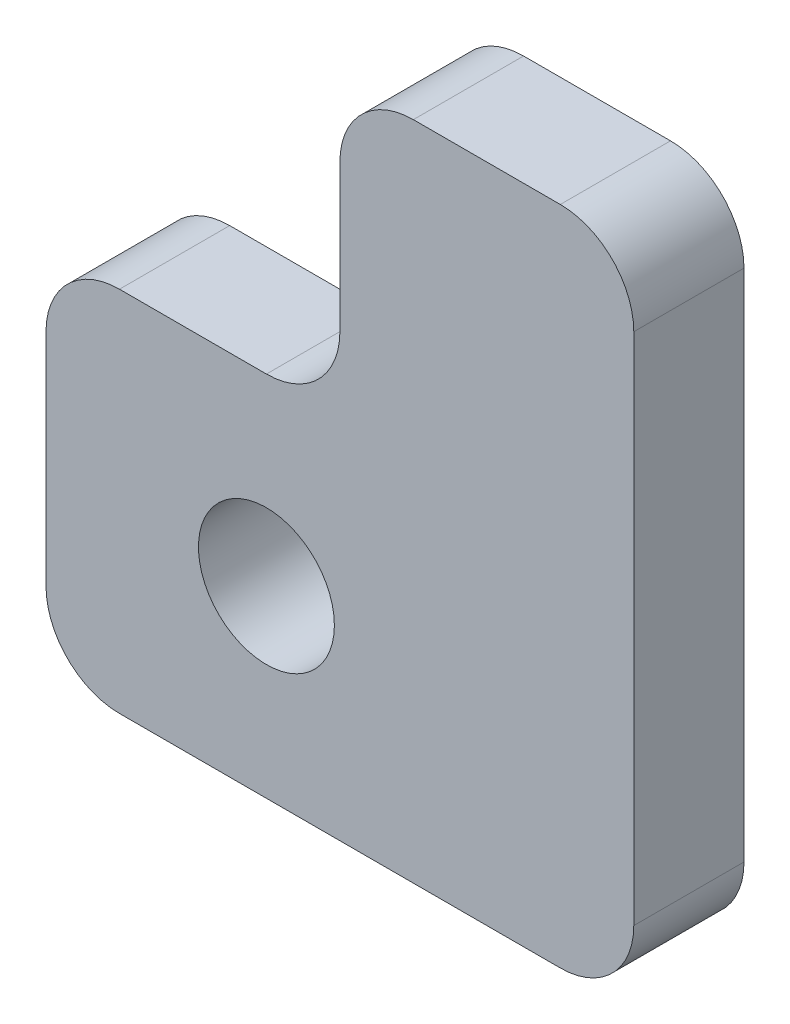
ISO-10303-21;
HEADER;
FILE_DESCRIPTION(('STEP AP214'),'2;1');
FILE_NAME('part.step','',(''),(''),'','','');
FILE_SCHEMA(('AUTOMOTIVE_DESIGN { 1 0 10303 214 1 1 1 1 }'));
ENDSEC;
DATA;
#1=APPLICATION_CONTEXT('core data for automotive mechanical design processes');
#2=APPLICATION_PROTOCOL_DEFINITION('international standard','automotive_design',2000,#1);
#3=PRODUCT_CONTEXT('',#1,'mechanical');
#4=PRODUCT('Part','Part','',(#3));
#5=PRODUCT_RELATED_PRODUCT_CATEGORY('part','',(#4));
#6=PRODUCT_DEFINITION_FORMATION('','',#4);
#7=PRODUCT_DEFINITION_CONTEXT('part definition',#1,'design');
#8=PRODUCT_DEFINITION('design','',#6,#7);
#9=PRODUCT_DEFINITION_SHAPE('','',#8);
#10=(LENGTH_UNIT() NAMED_UNIT(*) SI_UNIT(.MILLI.,.METRE.));
#11=(NAMED_UNIT(*) PLANE_ANGLE_UNIT() SI_UNIT($,.RADIAN.));
#12=(NAMED_UNIT(*) SI_UNIT($,.STERADIAN.) SOLID_ANGLE_UNIT());
#13=UNCERTAINTY_MEASURE_WITH_UNIT(LENGTH_MEASURE(1.E-05),#10,'distance_accuracy_value','');
#14=(GEOMETRIC_REPRESENTATION_CONTEXT(3) GLOBAL_UNCERTAINTY_ASSIGNED_CONTEXT((#13)) GLOBAL_UNIT_ASSIGNED_CONTEXT((#10,
#11,#12)) REPRESENTATION_CONTEXT('',''));
#15=CARTESIAN_POINT('',(0.,0.,0.));
#16=DIRECTION('',(0.,0.,1.));
#17=DIRECTION('',(1.,0.,0.));
#18=AXIS2_PLACEMENT_3D('',#15,#16,#17);
#19=CARTESIAN_POINT('',(-166.520340409626,18.1367473035253,-2.99999999999833));
#20=DIRECTION('',(0.,-1.,0.));
#21=DIRECTION('',(1.,0.,0.));
#22=AXIS2_PLACEMENT_3D('',#19,#20,#21);
#23=PLANE('',#22);
#24=DIRECTION('',(-1.,0.,0.));
#25=VECTOR('',#24,1.);
#26=CARTESIAN_POINT('',(-166.520340409626,18.1367473035253,1.67378461437092E-12));
#27=LINE('',#26,#25);
#28=CARTESIAN_POINT('',(-172.520340409626,18.1367473035253,1.67363592378726E-12));
#29=VERTEX_POINT('',#28);
#30=CARTESIAN_POINT('',(-176.520340409626,18.1367473035253,1.67353679673149E-12));
#31=VERTEX_POINT('',#30);
#32=EDGE_CURVE('E223',#29,#31,#27,.T.);
#33=ORIENTED_EDGE('',*,*,#32,.F.);
#34=DIRECTION('',(0.,0.,1.));
#35=VECTOR('',#34,1.);
#36=CARTESIAN_POINT('',(-172.520340409626,18.1367473035253,-2.99999999999832));
#37=LINE('',#36,#35);
#38=CARTESIAN_POINT('',(-172.520340409626,18.1367473035253,-2.99999999999833));
#39=VERTEX_POINT('',#38);
#40=EDGE_CURVE('E234',#29,#39,#37,.F.);
#41=ORIENTED_EDGE('',*,*,#40,.T.);
#42=DIRECTION('',(-1.,0.,0.));
#43=VECTOR('',#42,1.);
#44=CARTESIAN_POINT('',(-166.520340409626,18.1367473035253,-2.99999999999833));
#45=LINE('',#44,#43);
#46=CARTESIAN_POINT('',(-176.520340409626,18.1367473035253,-2.99999999999833));
#47=VERTEX_POINT('',#46);
#48=EDGE_CURVE('E220',#39,#47,#45,.T.);
#49=ORIENTED_EDGE('',*,*,#48,.T.);
#50=DIRECTION('',(0.,0.,1.));
#51=VECTOR('',#50,1.);
#52=CARTESIAN_POINT('',(-176.520340409626,18.1367473035253,1.67357447344862E-12));
#53=LINE('',#52,#51);
#54=EDGE_CURVE('E231',#47,#31,#53,.T.);
#55=ORIENTED_EDGE('',*,*,#54,.T.);
#56=EDGE_LOOP('',(#33,#41,#49,#55));
#57=FACE_BOUND('',#56,.T.);
#58=ADVANCED_FACE('F44',(#57),#23,.F.);
#59=CARTESIAN_POINT('',(-166.520340409626,0.,0.));
#60=DIRECTION('',(-1.,0.,0.));
#61=DIRECTION('',(0.,0.,1.));
#62=AXIS2_PLACEMENT_3D('',#59,#60,#61);
#63=PLANE('',#62);
#64=DIRECTION('',(0.,1.,0.));
#65=VECTOR('',#64,1.);
#66=CARTESIAN_POINT('',(-166.520340409626,0.,-2.99999999999833));
#67=LINE('',#66,#65);
#68=CARTESIAN_POINT('',(-166.520340409626,11.3353998415927,-2.99999999999833));
#69=VERTEX_POINT('',#68);
#70=CARTESIAN_POINT('',(-166.520340409626,14.9357670611535,-2.99999999999833));
#71=VERTEX_POINT('',#70);
#72=EDGE_CURVE('E171',#69,#71,#67,.T.);
#73=ORIENTED_EDGE('',*,*,#72,.F.);
#74=DIRECTION('',(0.,-0.624695047554423,0.780868809443031));
#75=VECTOR('',#74,1.);
#76=CARTESIAN_POINT('',(-166.520340409626,13.1355834513731,-5.25022951222383));
#77=LINE('',#76,#75);
#78=CARTESIAN_POINT('',(-166.520340409626,13.1355834513731,-5.25022951222383));
#79=VERTEX_POINT('',#78);
#80=EDGE_CURVE('E175',#79,#69,#77,.T.);
#81=ORIENTED_EDGE('',*,*,#80,.F.);
#82=DIRECTION('',(0.,-0.624695047554423,-0.780868809443031));
#83=VECTOR('',#82,1.);
#84=CARTESIAN_POINT('',(-166.520340409626,14.9357670611535,-2.99999999999833));
#85=LINE('',#84,#83);
#86=EDGE_CURVE('E177',#71,#79,#85,.T.);
#87=ORIENTED_EDGE('',*,*,#86,.F.);
#88=EDGE_LOOP('',(#73,#81,#87));
#89=FACE_BOUND('',#88,.T.);
#90=ADVANCED_FACE('F173',(#89),#63,.F.);
#91=CARTESIAN_POINT('',(-166.520340409626,13.1355834513731,-5.25022951222383));
#92=DIRECTION('',(0.,-0.780868809443031,-0.624695047554423));
#93=DIRECTION('',(0.,0.624695047554423,-0.780868809443031));
#94=AXIS2_PLACEMENT_3D('',#91,#92,#93);
#95=PLANE('',#94);
#96=CARTESIAN_POINT('',(-172.520340409626,13.1367473035253,-5.25168432741411));
#97=DIRECTION('',(0.,-0.780868809443031,-0.624695047554423));
#98=DIRECTION('',(0.,-0.624695047554423,0.780868809443031));
#99=AXIS2_PLACEMENT_3D('',#96,#97,#98);
#100=ELLIPSE('',#99,2.9614449598127,1.85);
#101=CARTESIAN_POINT('',(-172.941822700344,11.3353998415927,-2.99999999999833));
#102=VERTEX_POINT('',#101);
#103=CARTESIAN_POINT('',(-174.370340043531,13.1355834513731,-5.25022951222383));
#104=VERTEX_POINT('',#103);
#105=EDGE_CURVE('E318',#102,#104,#100,.T.);
#106=ORIENTED_EDGE('',*,*,#105,.F.);
#107=DIRECTION('',(-1.,0.,0.));
#108=VECTOR('',#107,1.);
#109=CARTESIAN_POINT('',(-166.520340409626,11.3353998415927,-2.99999999999833));
#110=LINE('',#109,#108);
#111=CARTESIAN_POINT('',(-178.520340409626,11.3353998415927,-2.99999999999833));
#112=VERTEX_POINT('',#111);
#113=EDGE_CURVE('E190',#102,#112,#110,.T.);
#114=ORIENTED_EDGE('',*,*,#113,.T.);
#115=DIRECTION('',(0.,-0.624695047554423,0.780868809443031));
#116=VECTOR('',#115,1.);
#117=CARTESIAN_POINT('',(-178.520340409626,13.1355834513731,-5.25022951222383));
#118=LINE('',#117,#116);
#119=CARTESIAN_POINT('',(-178.520340409626,13.1355834513731,-5.25022951222383));
#120=VERTEX_POINT('',#119);
#121=EDGE_CURVE('E199',#120,#112,#118,.T.);
#122=ORIENTED_EDGE('',*,*,#121,.F.);
#123=DIRECTION('',(-1.,0.,0.));
#124=VECTOR('',#123,1.);
#125=CARTESIAN_POINT('',(-166.520340409626,13.1355834513731,-5.25022951222383));
#126=LINE('',#125,#124);
#127=EDGE_CURVE('E216',#104,#120,#126,.T.);
#128=ORIENTED_EDGE('',*,*,#127,.F.);
#129=EDGE_LOOP('',(#106,#114,#122,#128));
#130=FACE_BOUND('',#129,.T.);
#131=ADVANCED_FACE('F333',(#130),#95,.T.);
#132=CARTESIAN_POINT('',(-166.520340409626,14.9357670611535,-2.99999999999833));
#133=DIRECTION('',(0.,0.780868809443031,-0.624695047554423));
#134=DIRECTION('',(0.,0.624695047554423,0.780868809443031));
#135=AXIS2_PLACEMENT_3D('',#132,#133,#134);
#136=PLANE('',#135);
#137=CARTESIAN_POINT('',(-172.520340409626,13.1367473035253,-5.24877469703356));
#138=DIRECTION('',(0.,0.780868809443031,-0.624695047554423));
#139=DIRECTION('',(0.,0.624695047554423,0.780868809443031));
#140=AXIS2_PLACEMENT_3D('',#137,#138,#139);
#141=ELLIPSE('',#140,2.9614449598127,1.85);
#142=CARTESIAN_POINT('',(-172.089030878473,14.9357670611535,-2.99999999999833));
#143=VERTEX_POINT('',#142);
#144=CARTESIAN_POINT('',(-170.670340775721,13.1355834513731,-5.25022951222383));
#145=VERTEX_POINT('',#144);
#146=EDGE_CURVE('E316',#143,#145,#141,.T.);
#147=ORIENTED_EDGE('',*,*,#146,.F.);
#148=DIRECTION('',(-1.,0.,0.));
#149=VECTOR('',#148,1.);
#150=CARTESIAN_POINT('',(-166.520340409626,14.9357670611535,-2.99999999999833));
#151=LINE('',#150,#149);
#152=EDGE_CURVE('E217',#71,#143,#151,.T.);
#153=ORIENTED_EDGE('',*,*,#152,.F.);
#154=ORIENTED_EDGE('',*,*,#86,.T.);
#155=EDGE_CURVE('E194',#79,#145,#126,.T.);
#156=ORIENTED_EDGE('',*,*,#155,.T.);
#157=EDGE_LOOP('',(#147,#153,#154,#156));
#158=FACE_BOUND('',#157,.T.);
#159=ADVANCED_FACE('F343',(#158),#136,.T.);
#160=CARTESIAN_POINT('',(-172.098858118908,11.3353998415927,-2.99999999999833));
#161=VERTEX_POINT('',#160);
#162=EDGE_CURVE('E317',#145,#161,#100,.T.);
#163=ORIENTED_EDGE('',*,*,#162,.F.);
#164=ORIENTED_EDGE('',*,*,#155,.F.);
#165=ORIENTED_EDGE('',*,*,#80,.T.);
#166=EDGE_CURVE('E180',#69,#161,#110,.T.);
#167=ORIENTED_EDGE('',*,*,#166,.T.);
#168=EDGE_LOOP('',(#163,#164,#165,#167));
#169=FACE_BOUND('',#168,.T.);
#170=ADVANCED_FACE('F192',(#169),#95,.T.);
#171=CARTESIAN_POINT('',(-172.951649940779,14.9357670611535,-2.99999999999833));
#172=VERTEX_POINT('',#171);
#173=EDGE_CURVE('E314',#104,#172,#141,.T.);
#174=ORIENTED_EDGE('',*,*,#173,.F.);
#175=ORIENTED_EDGE('',*,*,#127,.T.);
#176=DIRECTION('',(0.,-0.624695047554423,-0.780868809443031));
#177=VECTOR('',#176,1.);
#178=CARTESIAN_POINT('',(-178.520340409626,14.9357670611535,-2.99999999999833));
#179=LINE('',#178,#177);
#180=CARTESIAN_POINT('',(-178.520340409626,14.9357670611535,-2.99999999999833));
#181=VERTEX_POINT('',#180);
#182=EDGE_CURVE('E210',#181,#120,#179,.T.);
#183=ORIENTED_EDGE('',*,*,#182,.F.);
#184=EDGE_CURVE('E219',#172,#181,#151,.T.);
#185=ORIENTED_EDGE('',*,*,#184,.F.);
#186=EDGE_LOOP('',(#174,#175,#183,#185));
#187=FACE_BOUND('',#186,.T.);
#188=ADVANCED_FACE('F329',(#187),#136,.T.);
#189=CARTESIAN_POINT('',(-166.520340409626,18.1367473035253,-2.99999999999833));
#190=DIRECTION('',(0.,0.,-1.));
#191=DIRECTION('',(0.,1.,0.));
#192=AXIS2_PLACEMENT_3D('',#189,#190,#191);
#193=PLANE('',#192);
#194=DIRECTION('',(0.,1.,0.));
#195=VECTOR('',#194,1.);
#196=CARTESIAN_POINT('',(-170.520340409626,26.1344195992209,-2.99999999999832));
#197=LINE('',#196,#195);
#198=CARTESIAN_POINT('',(-170.520340409626,20.1367473035253,-2.99999999999832));
#199=VERTEX_POINT('',#198);
#200=CARTESIAN_POINT('',(-170.520340409626,24.1344195992209,-2.99999999999832));
#201=VERTEX_POINT('',#200);
#202=EDGE_CURVE('E290',#199,#201,#197,.T.);
#203=ORIENTED_EDGE('',*,*,#202,.T.);
#204=CARTESIAN_POINT('',(-168.520340409626,24.1344195992209,-2.99999999999833));
#205=DIRECTION('',(0.,0.,-1.));
#206=DIRECTION('',(0.,1.,0.));
#207=AXIS2_PLACEMENT_3D('',#204,#205,#206);
#208=CIRCLE('',#207,2.);
#209=CARTESIAN_POINT('',(-168.520340409626,26.1344195992209,-2.99999999999832));
#210=VERTEX_POINT('',#209);
#211=EDGE_CURVE('E258',#201,#210,#208,.T.);
#212=ORIENTED_EDGE('',*,*,#211,.T.);
#213=DIRECTION('',(-1.,0.,0.));
#214=VECTOR('',#213,1.);
#215=CARTESIAN_POINT('',(-162.520340409626,26.1344195992209,-2.99999999999832));
#216=LINE('',#215,#214);
#217=CARTESIAN_POINT('',(-164.520340409626,26.1344195992209,-2.99999999999832));
#218=VERTEX_POINT('',#217);
#219=EDGE_CURVE('E305',#218,#210,#216,.T.);
#220=ORIENTED_EDGE('',*,*,#219,.F.);
#221=CARTESIAN_POINT('',(-164.520340409626,24.1344195992209,-2.99999999999833));
#222=DIRECTION('',(0.,0.,-1.));
#223=DIRECTION('',(0.,1.,0.));
#224=AXIS2_PLACEMENT_3D('',#221,#222,#223);
#225=CIRCLE('',#224,2.);
#226=CARTESIAN_POINT('',(-162.520340409626,24.1344195992209,-2.99999999999832));
#227=VERTEX_POINT('',#226);
#228=EDGE_CURVE('E251',#218,#227,#225,.T.);
#229=ORIENTED_EDGE('',*,*,#228,.T.);
#230=DIRECTION('',(0.,1.,0.));
#231=VECTOR('',#230,1.);
#232=CARTESIAN_POINT('',(-162.520340409626,26.1344195992209,-2.99999999999832));
#233=LINE('',#232,#231);
#234=CARTESIAN_POINT('',(-162.520340409626,10.1344195992209,-2.99999999999833));
#235=VERTEX_POINT('',#234);
#236=EDGE_CURVE('E298',#235,#227,#233,.T.);
#237=ORIENTED_EDGE('',*,*,#236,.F.);
#238=CARTESIAN_POINT('',(-164.520340409626,10.1344195992209,-2.99999999999833));
#239=DIRECTION('',(0.,0.,-1.));
#240=DIRECTION('',(0.,1.,0.));
#241=AXIS2_PLACEMENT_3D('',#238,#239,#240);
#242=CIRCLE('',#241,2.);
#243=CARTESIAN_POINT('',(-164.520340409626,8.13441959922088,-2.99999999999833));
#244=VERTEX_POINT('',#243);
#245=EDGE_CURVE('E253',#235,#244,#242,.T.);
#246=ORIENTED_EDGE('',*,*,#245,.T.);
#247=DIRECTION('',(-1.,0.,0.));
#248=VECTOR('',#247,1.);
#249=CARTESIAN_POINT('',(-166.520340409626,8.13441959922088,-2.99999999999833));
#250=LINE('',#249,#248);
#251=CARTESIAN_POINT('',(-176.520340409626,8.13441959922089,-2.99999999999833));
#252=VERTEX_POINT('',#251);
#253=EDGE_CURVE('E195',#244,#252,#250,.T.);
#254=ORIENTED_EDGE('',*,*,#253,.T.);
#255=CARTESIAN_POINT('',(-176.520340409626,10.1344195992209,-2.99999999999833));
#256=DIRECTION('',(0.,0.,-1.));
#257=DIRECTION('',(0.,1.,0.));
#258=AXIS2_PLACEMENT_3D('',#255,#256,#257);
#259=CIRCLE('',#258,2.);
#260=CARTESIAN_POINT('',(-178.520340409626,10.1344195992209,-2.99999999999833));
#261=VERTEX_POINT('',#260);
#262=EDGE_CURVE('E59',#252,#261,#259,.T.);
#263=ORIENTED_EDGE('',*,*,#262,.T.);
#264=DIRECTION('',(0.,-1.,0.));
#265=VECTOR('',#264,1.);
#266=CARTESIAN_POINT('',(-178.520340409626,11.3353998415927,-2.99999999999833));
#267=LINE('',#266,#265);
#268=EDGE_CURVE('E203',#112,#261,#267,.T.);
#269=ORIENTED_EDGE('',*,*,#268,.F.);
#270=ORIENTED_EDGE('',*,*,#113,.F.);
#271=CARTESIAN_POINT('',(-172.520340409626,13.1367473035253,-2.99999999999833));
#272=DIRECTION('',(0.,0.,-1.));
#273=DIRECTION('',(0.,1.,0.));
#274=AXIS2_PLACEMENT_3D('',#271,#272,#273);
#275=CIRCLE('',#274,1.85);
#276=EDGE_CURVE('E186',#161,#102,#275,.T.);
#277=ORIENTED_EDGE('',*,*,#276,.F.);
#278=ORIENTED_EDGE('',*,*,#166,.F.);
#279=ORIENTED_EDGE('',*,*,#72,.T.);
#280=ORIENTED_EDGE('',*,*,#152,.T.);
#281=CARTESIAN_POINT('',(-172.520340409626,13.1367473035253,-2.99999999999833));
#282=DIRECTION('',(0.,0.,-1.));
#283=DIRECTION('',(0.,1.,0.));
#284=AXIS2_PLACEMENT_3D('',#281,#282,#283);
#285=CIRCLE('',#284,1.85);
#286=EDGE_CURVE('E311',#172,#143,#285,.T.);
#287=ORIENTED_EDGE('',*,*,#286,.F.);
#288=ORIENTED_EDGE('',*,*,#184,.T.);
#289=DIRECTION('',(0.,-1.,0.));
#290=VECTOR('',#289,1.);
#291=CARTESIAN_POINT('',(-178.520340409626,18.1367473035253,-2.99999999999833));
#292=LINE('',#291,#290);
#293=CARTESIAN_POINT('',(-178.520340409626,16.1367473035253,-2.99999999999833));
#294=VERTEX_POINT('',#293);
#295=EDGE_CURVE('E208',#294,#181,#292,.T.);
#296=ORIENTED_EDGE('',*,*,#295,.F.);
#297=CARTESIAN_POINT('',(-176.520340409626,16.1367473035253,-2.99999999999833));
#298=DIRECTION('',(0.,0.,-1.));
#299=DIRECTION('',(0.,1.,0.));
#300=AXIS2_PLACEMENT_3D('',#297,#298,#299);
#301=CIRCLE('',#300,2.);
#302=EDGE_CURVE('E255',#294,#47,#301,.T.);
#303=ORIENTED_EDGE('',*,*,#302,.T.);
#304=ORIENTED_EDGE('',*,*,#48,.F.);
#305=CARTESIAN_POINT('',(-172.520340409626,20.1367473035253,-2.99999999999833));
#306=DIRECTION('',(0.,0.,-1.));
#307=DIRECTION('',(0.,1.,0.));
#308=AXIS2_PLACEMENT_3D('',#305,#306,#307);
#309=CIRCLE('',#308,2.);
#310=EDGE_CURVE('E13',#39,#199,#309,.F.);
#311=ORIENTED_EDGE('',*,*,#310,.T.);
#312=EDGE_LOOP('',(#203,#212,#220,#229,#237,#246,#254,#263,#269,#270,#277,#278,#279,#280,#287,
#288,#296,#303,#304,#311));
#313=FACE_BOUND('',#312,.T.);
#314=ADVANCED_FACE('F184',(#313),#193,.T.);
#315=CARTESIAN_POINT('',(-166.520340409626,18.1367473035253,1.67378461437092E-12));
#316=DIRECTION('',(0.,0.,-1.));
#317=DIRECTION('',(-1.,0.,0.));
#318=AXIS2_PLACEMENT_3D('',#315,#316,#317);
#319=PLANE('',#318);
#320=DIRECTION('',(-1.,0.,0.));
#321=VECTOR('',#320,1.);
#322=CARTESIAN_POINT('',(-162.520340409626,26.1344195992209,1.67593469166373E-12));
#323=LINE('',#322,#321);
#324=CARTESIAN_POINT('',(-164.520340409626,26.1344195992209,1.67593469166373E-12));
#325=VERTEX_POINT('',#324);
#326=CARTESIAN_POINT('',(-168.520340409626,26.1344195992209,1.67593469166373E-12));
#327=VERTEX_POINT('',#326);
#328=EDGE_CURVE('E303',#325,#327,#323,.T.);
#329=ORIENTED_EDGE('',*,*,#328,.T.);
#330=CARTESIAN_POINT('',(-168.520340409626,24.1344195992209,1.67373505084303E-12));
#331=DIRECTION('',(0.,0.,-1.));
#332=DIRECTION('',(-1.,0.,0.));
#333=AXIS2_PLACEMENT_3D('',#330,#331,#332);
#334=CIRCLE('',#333,2.);
#335=CARTESIAN_POINT('',(-170.520340409626,24.1344195992209,1.6756897623039E-12));
#336=VERTEX_POINT('',#335);
#337=EDGE_CURVE('E249',#327,#336,#334,.F.);
#338=ORIENTED_EDGE('',*,*,#337,.T.);
#339=DIRECTION('',(0.,-1.,0.));
#340=VECTOR('',#339,1.);
#341=CARTESIAN_POINT('',(-170.520340409626,26.1344195992209,1.67593469166373E-12));
#342=LINE('',#341,#340);
#343=CARTESIAN_POINT('',(-170.520340409626,20.1367473035253,1.6752001886458E-12));
#344=VERTEX_POINT('',#343);
#345=EDGE_CURVE('E280',#336,#344,#342,.T.);
#346=ORIENTED_EDGE('',*,*,#345,.T.);
#347=CARTESIAN_POINT('',(-172.520340409626,20.1367473035253,1.67363592378726E-12));
#348=DIRECTION('',(0.,0.,-1.));
#349=DIRECTION('',(-1.,0.,0.));
#350=AXIS2_PLACEMENT_3D('',#347,#348,#349);
#351=CIRCLE('',#350,2.);
#352=EDGE_CURVE('E52',#344,#29,#351,.T.);
#353=ORIENTED_EDGE('',*,*,#352,.T.);
#354=ORIENTED_EDGE('',*,*,#32,.T.);
#355=CARTESIAN_POINT('',(-176.520340409626,16.1367473035253,1.67314079257963E-12));
#356=DIRECTION('',(0.,0.,-1.));
#357=DIRECTION('',(-1.,0.,0.));
#358=AXIS2_PLACEMENT_3D('',#355,#356,#357);
#359=CIRCLE('',#358,2.);
#360=CARTESIAN_POINT('',(-178.520340409626,16.1367473035253,1.67348723320361E-12));
#361=VERTEX_POINT('',#360);
#362=EDGE_CURVE('E245',#31,#361,#359,.F.);
#363=ORIENTED_EDGE('',*,*,#362,.T.);
#364=DIRECTION('',(0.,-1.,0.));
#365=VECTOR('',#364,1.);
#366=CARTESIAN_POINT('',(-178.520340409626,18.1367473035253,1.67348723320361E-12));
#367=LINE('',#366,#365);
#368=CARTESIAN_POINT('',(-178.520340409626,10.1344195992209,1.67348723320361E-12));
#369=VERTEX_POINT('',#368);
#370=EDGE_CURVE('E205',#361,#369,#367,.T.);
#371=ORIENTED_EDGE('',*,*,#370,.T.);
#372=CARTESIAN_POINT('',(-176.520340409626,10.1344195992209,1.67353679673149E-12));
#373=DIRECTION('',(0.,0.,-1.));
#374=DIRECTION('',(-1.,0.,0.));
#375=AXIS2_PLACEMENT_3D('',#372,#373,#374);
#376=CIRCLE('',#375,2.);
#377=CARTESIAN_POINT('',(-176.520340409626,8.13441959922089,1.67353679673149E-12));
#378=VERTEX_POINT('',#377);
#379=EDGE_CURVE('E247',#369,#378,#376,.F.);
#380=ORIENTED_EDGE('',*,*,#379,.T.);
#381=DIRECTION('',(-1.,0.,0.));
#382=VECTOR('',#381,1.);
#383=CARTESIAN_POINT('',(-166.520340409626,8.13441959922088,1.67378461437092E-12));
#384=LINE('',#383,#382);
#385=CARTESIAN_POINT('',(-164.520340409626,8.13441959922088,1.6738341778988E-12));
#386=VERTEX_POINT('',#385);
#387=EDGE_CURVE('E197',#386,#378,#384,.T.);
#388=ORIENTED_EDGE('',*,*,#387,.F.);
#389=CARTESIAN_POINT('',(-164.520340409626,10.1344195992209,1.6738341778988E-12));
#390=DIRECTION('',(0.,0.,-1.));
#391=DIRECTION('',(-1.,0.,0.));
#392=AXIS2_PLACEMENT_3D('',#389,#390,#391);
#393=CIRCLE('',#392,2.);
#394=CARTESIAN_POINT('',(-162.520340409626,10.1344195992209,1.67397525678509E-12));
#395=VERTEX_POINT('',#394);
#396=EDGE_CURVE('E243',#386,#395,#393,.F.);
#397=ORIENTED_EDGE('',*,*,#396,.T.);
#398=DIRECTION('',(0.,-1.,0.));
#399=VECTOR('',#398,1.);
#400=CARTESIAN_POINT('',(-162.520340409626,26.1344195992209,1.67593469166373E-12));
#401=LINE('',#400,#399);
#402=CARTESIAN_POINT('',(-162.520340409626,24.1344195992209,1.6756897623039E-12));
#403=VERTEX_POINT('',#402);
#404=EDGE_CURVE('E295',#403,#395,#401,.T.);
#405=ORIENTED_EDGE('',*,*,#404,.F.);
#406=CARTESIAN_POINT('',(-164.520340409626,24.1344195992209,1.6738341778988E-12));
#407=DIRECTION('',(0.,0.,-1.));
#408=DIRECTION('',(-1.,0.,0.));
#409=AXIS2_PLACEMENT_3D('',#406,#407,#408);
#410=CIRCLE('',#409,2.);
#411=EDGE_CURVE('E241',#403,#325,#410,.F.);
#412=ORIENTED_EDGE('',*,*,#411,.T.);
#413=EDGE_LOOP('',(#329,#338,#346,#353,#354,#363,#371,#380,#388,#397,#405,#412));
#414=FACE_BOUND('',#413,.T.);
#415=CARTESIAN_POINT('',(-172.520340409626,13.1367473035253,0.));
#416=DIRECTION('',(0.,0.,1.));
#417=DIRECTION('',(1.,0.,0.));
#418=AXIS2_PLACEMENT_3D('',#415,#416,#417);
#419=CIRCLE('',#418,1.85);
#420=CARTESIAN_POINT('',(-170.670340409626,13.1367473035253,0.));
#421=VERTEX_POINT('',#420);
#422=EDGE_CURVE('E308',#421,#421,#419,.T.);
#423=ORIENTED_EDGE('',*,*,#422,.F.);
#424=EDGE_LOOP('',(#423));
#425=FACE_BOUND('',#424,.T.);
#426=ADVANCED_FACE('F277',(#414,#425),#319,.F.);
#427=CARTESIAN_POINT('',(-166.520340409626,8.13441959922088,-2.99999999999833));
#428=DIRECTION('',(0.,-1.,0.));
#429=DIRECTION('',(1.,0.,0.));
#430=AXIS2_PLACEMENT_3D('',#427,#428,#429);
#431=PLANE('',#430);
#432=ORIENTED_EDGE('',*,*,#387,.T.);
#433=DIRECTION('',(0.,0.,1.));
#434=VECTOR('',#433,1.);
#435=CARTESIAN_POINT('',(-176.520340409626,8.13441959922089,-2.99999999999833));
#436=LINE('',#435,#434);
#437=EDGE_CURVE('E67',#378,#252,#436,.F.);
#438=ORIENTED_EDGE('',*,*,#437,.T.);
#439=ORIENTED_EDGE('',*,*,#253,.F.);
#440=DIRECTION('',(0.,0.,-1.));
#441=VECTOR('',#440,1.);
#442=CARTESIAN_POINT('',(-164.520340409626,8.13441959922088,-2.99999999999833));
#443=LINE('',#442,#441);
#444=EDGE_CURVE('E265',#244,#386,#443,.F.);
#445=ORIENTED_EDGE('',*,*,#444,.T.);
#446=EDGE_LOOP('',(#432,#438,#439,#445));
#447=FACE_BOUND('',#446,.T.);
#448=ADVANCED_FACE('F362',(#447),#431,.T.);
#449=CARTESIAN_POINT('',(-178.520340409626,0.,0.));
#450=DIRECTION('',(-1.,0.,0.));
#451=DIRECTION('',(0.,0.,1.));
#452=AXIS2_PLACEMENT_3D('',#449,#450,#451);
#453=PLANE('',#452);
#454=ORIENTED_EDGE('',*,*,#268,.T.);
#455=DIRECTION('',(0.,0.,1.));
#456=VECTOR('',#455,1.);
#457=CARTESIAN_POINT('',(-178.520340409626,10.1344195992209,0.));
#458=LINE('',#457,#456);
#459=EDGE_CURVE('E262',#261,#369,#458,.T.);
#460=ORIENTED_EDGE('',*,*,#459,.T.);
#461=ORIENTED_EDGE('',*,*,#370,.F.);
#462=DIRECTION('',(0.,0.,1.));
#463=VECTOR('',#462,1.);
#464=CARTESIAN_POINT('',(-178.520340409626,16.1367473035253,-2.99999999999833));
#465=LINE('',#464,#463);
#466=EDGE_CURVE('E260',#361,#294,#465,.F.);
#467=ORIENTED_EDGE('',*,*,#466,.T.);
#468=ORIENTED_EDGE('',*,*,#295,.T.);
#469=ORIENTED_EDGE('',*,*,#182,.T.);
#470=ORIENTED_EDGE('',*,*,#121,.T.);
#471=EDGE_LOOP('',(#454,#460,#461,#467,#468,#469,#470));
#472=FACE_BOUND('',#471,.T.);
#473=ADVANCED_FACE('F335',(#472),#453,.T.);
#474=CARTESIAN_POINT('',(-172.520340409626,13.1367473035253,-12.));
#475=DIRECTION('',(0.,0.,1.));
#476=DIRECTION('',(1.,0.,0.));
#477=AXIS2_PLACEMENT_3D('',#474,#475,#476);
#478=CYLINDRICAL_SURFACE('',#477,1.85);
#479=ORIENTED_EDGE('',*,*,#276,.T.);
#480=ORIENTED_EDGE('',*,*,#105,.T.);
#481=ORIENTED_EDGE('',*,*,#173,.T.);
#482=ORIENTED_EDGE('',*,*,#286,.T.);
#483=ORIENTED_EDGE('',*,*,#146,.T.);
#484=ORIENTED_EDGE('',*,*,#162,.T.);
#485=EDGE_LOOP('',(#479,#480,#481,#482,#483,#484));
#486=FACE_BOUND('',#485,.T.);
#487=ORIENTED_EDGE('',*,*,#422,.T.);
#488=EDGE_LOOP('',(#487));
#489=FACE_BOUND('',#488,.T.);
#490=ADVANCED_FACE('F322',(#486,#489),#478,.F.);
#491=CARTESIAN_POINT('',(-170.520340409626,0.,0.));
#492=DIRECTION('',(1.,0.,0.));
#493=DIRECTION('',(0.,0.,-1.));
#494=AXIS2_PLACEMENT_3D('',#491,#492,#493);
#495=PLANE('',#494);
#496=ORIENTED_EDGE('',*,*,#202,.F.);
#497=DIRECTION('',(0.,0.,1.));
#498=VECTOR('',#497,1.);
#499=CARTESIAN_POINT('',(-170.520340409626,20.1367473035253,1.67495525928597E-12));
#500=LINE('',#499,#498);
#501=EDGE_CURVE('E228',#199,#344,#500,.T.);
#502=ORIENTED_EDGE('',*,*,#501,.T.);
#503=ORIENTED_EDGE('',*,*,#345,.F.);
#504=DIRECTION('',(0.,0.,1.));
#505=VECTOR('',#504,1.);
#506=CARTESIAN_POINT('',(-170.520340409626,24.1344195992209,0.));
#507=LINE('',#506,#505);
#508=EDGE_CURVE('E179',#336,#201,#507,.F.);
#509=ORIENTED_EDGE('',*,*,#508,.T.);
#510=EDGE_LOOP('',(#496,#502,#503,#509));
#511=FACE_BOUND('',#510,.T.);
#512=ADVANCED_FACE('F293',(#511),#495,.F.);
#513=CARTESIAN_POINT('',(-162.520340409626,26.1344195992209,1.67593469166373E-12));
#514=DIRECTION('',(0.,-1.,0.));
#515=DIRECTION('',(0.,0.,-1.));
#516=AXIS2_PLACEMENT_3D('',#513,#514,#515);
#517=PLANE('',#516);
#518=ORIENTED_EDGE('',*,*,#219,.T.);
#519=DIRECTION('',(0.,0.,1.));
#520=VECTOR('',#519,1.);
#521=CARTESIAN_POINT('',(-168.520340409626,26.1344195992209,1.67593469166373E-12));
#522=LINE('',#521,#520);
#523=EDGE_CURVE('E238',#210,#327,#522,.T.);
#524=ORIENTED_EDGE('',*,*,#523,.T.);
#525=ORIENTED_EDGE('',*,*,#328,.F.);
#526=DIRECTION('',(0.,0.,1.));
#527=VECTOR('',#526,1.);
#528=CARTESIAN_POINT('',(-164.520340409626,26.1344195992209,-2.99999999999832));
#529=LINE('',#528,#527);
#530=EDGE_CURVE('E236',#325,#218,#529,.F.);
#531=ORIENTED_EDGE('',*,*,#530,.T.);
#532=EDGE_LOOP('',(#518,#524,#525,#531));
#533=FACE_BOUND('',#532,.T.);
#534=ADVANCED_FACE('F399',(#533),#517,.F.);
#535=CARTESIAN_POINT('',(-162.520340409626,0.,0.));
#536=DIRECTION('',(1.,0.,0.));
#537=DIRECTION('',(0.,0.,-1.));
#538=AXIS2_PLACEMENT_3D('',#535,#536,#537);
#539=PLANE('',#538);
#540=ORIENTED_EDGE('',*,*,#404,.T.);
#541=DIRECTION('',(0.,0.,-1.));
#542=VECTOR('',#541,1.);
#543=CARTESIAN_POINT('',(-162.520340409626,10.1344195992209,0.));
#544=LINE('',#543,#542);
#545=EDGE_CURVE('E271',#395,#235,#544,.T.);
#546=ORIENTED_EDGE('',*,*,#545,.T.);
#547=ORIENTED_EDGE('',*,*,#236,.T.);
#548=DIRECTION('',(0.,0.,1.));
#549=VECTOR('',#548,1.);
#550=CARTESIAN_POINT('',(-162.520340409626,24.1344195992209,1.67593469166373E-12));
#551=LINE('',#550,#549);
#552=EDGE_CURVE('E268',#227,#403,#551,.T.);
#553=ORIENTED_EDGE('',*,*,#552,.T.);
#554=EDGE_LOOP('',(#540,#546,#547,#553));
#555=FACE_BOUND('',#554,.T.);
#556=ADVANCED_FACE('F368',(#555),#539,.T.);
#557=CARTESIAN_POINT('',(-172.520340409626,20.1367473035253,0.));
#558=DIRECTION('',(0.,0.,-1.));
#559=DIRECTION('',(-1.,0.,0.));
#560=AXIS2_PLACEMENT_3D('',#557,#558,#559);
#561=CYLINDRICAL_SURFACE('',#560,2.);
#562=ORIENTED_EDGE('',*,*,#310,.F.);
#563=ORIENTED_EDGE('',*,*,#40,.F.);
#564=ORIENTED_EDGE('',*,*,#352,.F.);
#565=ORIENTED_EDGE('',*,*,#501,.F.);
#566=EDGE_LOOP('',(#562,#563,#564,#565));
#567=FACE_BOUND('',#566,.T.);
#568=ADVANCED_FACE('F288',(#567),#561,.F.);
#569=CARTESIAN_POINT('',(-168.520340409626,24.1344195992209,1.67593469166373E-12));
#570=DIRECTION('',(0.,0.,1.));
#571=DIRECTION('',(1.,0.,0.));
#572=AXIS2_PLACEMENT_3D('',#569,#570,#571);
#573=CYLINDRICAL_SURFACE('',#572,2.);
#574=ORIENTED_EDGE('',*,*,#211,.F.);
#575=ORIENTED_EDGE('',*,*,#508,.F.);
#576=ORIENTED_EDGE('',*,*,#337,.F.);
#577=ORIENTED_EDGE('',*,*,#523,.F.);
#578=EDGE_LOOP('',(#574,#575,#576,#577));
#579=FACE_BOUND('',#578,.T.);
#580=ADVANCED_FACE('F367',(#579),#573,.T.);
#581=CARTESIAN_POINT('',(-176.520340409626,10.1344195992209,0.));
#582=DIRECTION('',(0.,0.,1.));
#583=DIRECTION('',(1.,0.,0.));
#584=AXIS2_PLACEMENT_3D('',#581,#582,#583);
#585=CYLINDRICAL_SURFACE('',#584,2.);
#586=ORIENTED_EDGE('',*,*,#262,.F.);
#587=ORIENTED_EDGE('',*,*,#437,.F.);
#588=ORIENTED_EDGE('',*,*,#379,.F.);
#589=ORIENTED_EDGE('',*,*,#459,.F.);
#590=EDGE_LOOP('',(#586,#587,#588,#589));
#591=FACE_BOUND('',#590,.T.);
#592=ADVANCED_FACE('F371',(#591),#585,.T.);
#593=CARTESIAN_POINT('',(-176.520340409626,16.1367473035253,-2.99999999999833));
#594=DIRECTION('',(0.,0.,-1.));
#595=DIRECTION('',(-1.,0.,0.));
#596=AXIS2_PLACEMENT_3D('',#593,#594,#595);
#597=CYLINDRICAL_SURFACE('',#596,2.);
#598=ORIENTED_EDGE('',*,*,#302,.F.);
#599=ORIENTED_EDGE('',*,*,#466,.F.);
#600=ORIENTED_EDGE('',*,*,#362,.F.);
#601=ORIENTED_EDGE('',*,*,#54,.F.);
#602=EDGE_LOOP('',(#598,#599,#600,#601));
#603=FACE_BOUND('',#602,.T.);
#604=ADVANCED_FACE('F375',(#603),#597,.T.);
#605=CARTESIAN_POINT('',(-164.520340409626,10.1344195992209,0.));
#606=DIRECTION('',(0.,0.,-1.));
#607=DIRECTION('',(-1.,0.,0.));
#608=AXIS2_PLACEMENT_3D('',#605,#606,#607);
#609=CYLINDRICAL_SURFACE('',#608,2.);
#610=ORIENTED_EDGE('',*,*,#396,.F.);
#611=ORIENTED_EDGE('',*,*,#444,.F.);
#612=ORIENTED_EDGE('',*,*,#245,.F.);
#613=ORIENTED_EDGE('',*,*,#545,.F.);
#614=EDGE_LOOP('',(#610,#611,#612,#613));
#615=FACE_BOUND('',#614,.T.);
#616=ADVANCED_FACE('F378',(#615),#609,.T.);
#617=CARTESIAN_POINT('',(-164.520340409626,24.1344195992209,0.));
#618=DIRECTION('',(0.,0.,-1.));
#619=DIRECTION('',(-1.,0.,0.));
#620=AXIS2_PLACEMENT_3D('',#617,#618,#619);
#621=CYLINDRICAL_SURFACE('',#620,2.);
#622=ORIENTED_EDGE('',*,*,#228,.F.);
#623=ORIENTED_EDGE('',*,*,#530,.F.);
#624=ORIENTED_EDGE('',*,*,#411,.F.);
#625=ORIENTED_EDGE('',*,*,#552,.F.);
#626=EDGE_LOOP('',(#622,#623,#624,#625));
#627=FACE_BOUND('',#626,.T.);
#628=ADVANCED_FACE('F46',(#627),#621,.T.);
#629=CLOSED_SHELL('',(#58,#90,#131,#159,#170,#188,#314,#426,#448,#473,#490,#512,#534,#556,#568,
#580,#592,#604,#616,#628));
#630=MANIFOLD_SOLID_BREP('B2',#629);
#631=ADVANCED_BREP_SHAPE_REPRESENTATION('',(#18,#630),#14);
#632=SHAPE_DEFINITION_REPRESENTATION(#9,#631);
ENDSEC;
END-ISO-10303-21;
